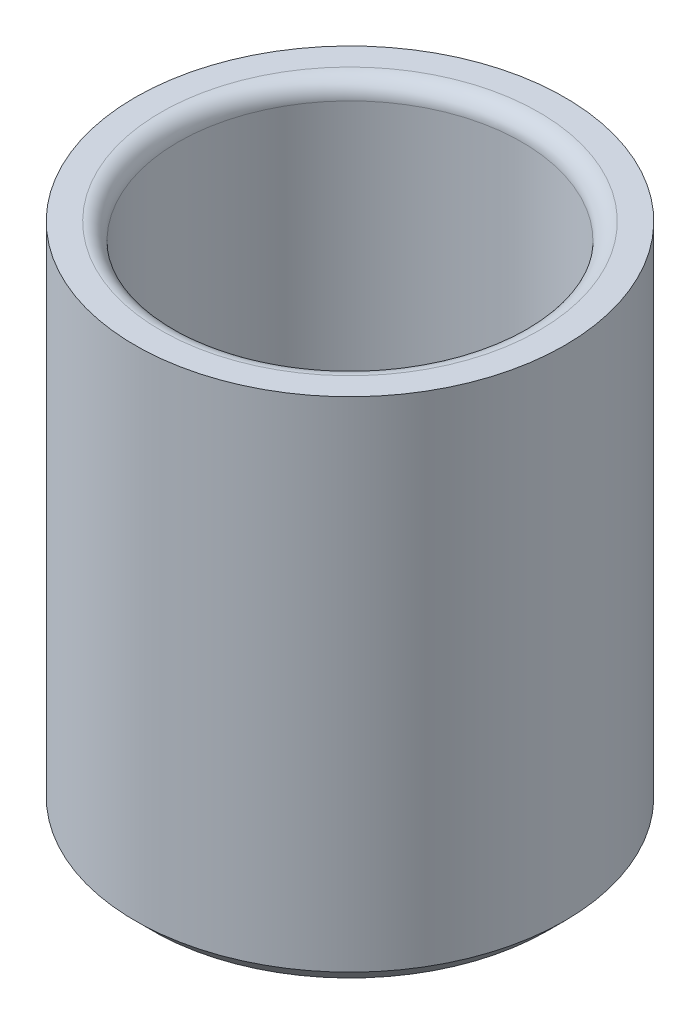
ISO-10303-21;
HEADER;
FILE_DESCRIPTION(('STEP AP214'),'2;1');
FILE_NAME('part.step','',(''),(''),'','','');
FILE_SCHEMA(('AUTOMOTIVE_DESIGN { 1 0 10303 214 1 1 1 1 }'));
ENDSEC;
DATA;
#1=APPLICATION_CONTEXT('core data for automotive mechanical design processes');
#2=APPLICATION_PROTOCOL_DEFINITION('international standard','automotive_design',2000,#1);
#3=PRODUCT_CONTEXT('',#1,'mechanical');
#4=PRODUCT('Part','Part','',(#3));
#5=PRODUCT_RELATED_PRODUCT_CATEGORY('part','',(#4));
#6=PRODUCT_DEFINITION_FORMATION('','',#4);
#7=PRODUCT_DEFINITION_CONTEXT('part definition',#1,'design');
#8=PRODUCT_DEFINITION('design','',#6,#7);
#9=PRODUCT_DEFINITION_SHAPE('','',#8);
#10=(LENGTH_UNIT() NAMED_UNIT(*) SI_UNIT(.MILLI.,.METRE.));
#11=(NAMED_UNIT(*) PLANE_ANGLE_UNIT() SI_UNIT($,.RADIAN.));
#12=(NAMED_UNIT(*) SI_UNIT($,.STERADIAN.) SOLID_ANGLE_UNIT());
#13=UNCERTAINTY_MEASURE_WITH_UNIT(LENGTH_MEASURE(1.E-05),#10,'distance_accuracy_value','');
#14=(GEOMETRIC_REPRESENTATION_CONTEXT(3) GLOBAL_UNCERTAINTY_ASSIGNED_CONTEXT((#13)) GLOBAL_UNIT_ASSIGNED_CONTEXT((#10,
#11,#12)) REPRESENTATION_CONTEXT('',''));
#15=CARTESIAN_POINT('',(0.,0.,0.));
#16=DIRECTION('',(0.,0.,1.));
#17=DIRECTION('',(1.,0.,0.));
#18=AXIS2_PLACEMENT_3D('',#15,#16,#17);
#19=CARTESIAN_POINT('',(0.,0.,0.));
#20=DIRECTION('',(0.,1.,0.));
#21=DIRECTION('',(-1.,0.,0.));
#22=AXIS2_PLACEMENT_3D('',#19,#20,#21);
#23=CYLINDRICAL_SURFACE('',#22,6.35);
#24=CARTESIAN_POINT('',(0.,-0.635000000000001,0.));
#25=DIRECTION('',(0.,-1.,0.));
#26=DIRECTION('',(1.,0.,0.));
#27=AXIS2_PLACEMENT_3D('',#24,#25,#26);
#28=CIRCLE('',#27,6.35);
#29=CARTESIAN_POINT('',(6.35,-0.635,0.));
#30=VERTEX_POINT('',#29);
#31=EDGE_CURVE('E51',#30,#30,#28,.F.);
#32=ORIENTED_EDGE('',*,*,#31,.T.);
#33=EDGE_LOOP('',(#32));
#34=FACE_BOUND('',#33,.T.);
#35=CARTESIAN_POINT('',(0.,-19.05,0.));
#36=DIRECTION('',(0.,1.,0.));
#37=DIRECTION('',(-1.,0.,0.));
#38=AXIS2_PLACEMENT_3D('',#35,#36,#37);
#39=CIRCLE('',#38,6.35);
#40=CARTESIAN_POINT('',(-6.35,-19.05,0.));
#41=VERTEX_POINT('',#40);
#42=EDGE_CURVE('E56',#41,#41,#39,.T.);
#43=ORIENTED_EDGE('',*,*,#42,.F.);
#44=EDGE_LOOP('',(#43));
#45=FACE_BOUND('',#44,.T.);
#46=ADVANCED_FACE('F36',(#34,#45),#23,.F.);
#47=CARTESIAN_POINT('',(6.35,-19.05,0.));
#48=DIRECTION('',(0.,1.,0.));
#49=DIRECTION('',(-1.,0.,0.));
#50=AXIS2_PLACEMENT_3D('',#47,#48,#49);
#51=PLANE('',#50);
#52=CARTESIAN_POINT('',(0.,-19.05,0.));
#53=DIRECTION('',(0.,1.,0.));
#54=DIRECTION('',(-1.,0.,0.));
#55=AXIS2_PLACEMENT_3D('',#52,#53,#54);
#56=CIRCLE('',#55,7.30249999999999);
#57=CARTESIAN_POINT('',(-7.30249999999999,-19.05,0.));
#58=VERTEX_POINT('',#57);
#59=EDGE_CURVE('E10',#58,#58,#56,.F.);
#60=ORIENTED_EDGE('',*,*,#59,.T.);
#61=EDGE_LOOP('',(#60));
#62=FACE_BOUND('',#61,.T.);
#63=ORIENTED_EDGE('',*,*,#42,.T.);
#64=EDGE_LOOP('',(#63));
#65=FACE_BOUND('',#64,.T.);
#66=ADVANCED_FACE('F67',(#62,#65),#51,.F.);
#67=CARTESIAN_POINT('',(0.,0.,0.));
#68=DIRECTION('',(0.,1.,0.));
#69=DIRECTION('',(-1.,0.,0.));
#70=AXIS2_PLACEMENT_3D('',#67,#68,#69);
#71=CYLINDRICAL_SURFACE('',#70,7.9375);
#72=CARTESIAN_POINT('',(0.,-18.415,0.));
#73=DIRECTION('',(0.,1.,0.));
#74=DIRECTION('',(-1.,0.,0.));
#75=AXIS2_PLACEMENT_3D('',#72,#73,#74);
#76=CIRCLE('',#75,7.9375);
#77=CARTESIAN_POINT('',(-7.9375,-18.415,0.));
#78=VERTEX_POINT('',#77);
#79=EDGE_CURVE('E43',#78,#78,#76,.T.);
#80=ORIENTED_EDGE('',*,*,#79,.T.);
#81=EDGE_LOOP('',(#80));
#82=FACE_BOUND('',#81,.T.);
#83=CARTESIAN_POINT('',(0.,0.,0.));
#84=DIRECTION('',(0.,1.,0.));
#85=DIRECTION('',(-1.,0.,0.));
#86=AXIS2_PLACEMENT_3D('',#83,#84,#85);
#87=CIRCLE('',#86,7.9375);
#88=CARTESIAN_POINT('',(-7.9375,0.,0.));
#89=VERTEX_POINT('',#88);
#90=EDGE_CURVE('E59',#89,#89,#87,.T.);
#91=ORIENTED_EDGE('',*,*,#90,.F.);
#92=EDGE_LOOP('',(#91));
#93=FACE_BOUND('',#92,.T.);
#94=ADVANCED_FACE('F65',(#82,#93),#71,.T.);
#95=CARTESIAN_POINT('',(6.35,0.,0.));
#96=DIRECTION('',(0.,-1.,0.));
#97=DIRECTION('',(1.,0.,0.));
#98=AXIS2_PLACEMENT_3D('',#95,#96,#97);
#99=PLANE('',#98);
#100=CARTESIAN_POINT('',(0.,0.,0.));
#101=DIRECTION('',(0.,-1.,0.));
#102=DIRECTION('',(1.,0.,0.));
#103=AXIS2_PLACEMENT_3D('',#100,#101,#102);
#104=CIRCLE('',#103,6.985);
#105=CARTESIAN_POINT('',(6.985,0.,0.));
#106=VERTEX_POINT('',#105);
#107=EDGE_CURVE('E47',#106,#106,#104,.T.);
#108=ORIENTED_EDGE('',*,*,#107,.T.);
#109=EDGE_LOOP('',(#108));
#110=FACE_BOUND('',#109,.T.);
#111=ORIENTED_EDGE('',*,*,#90,.T.);
#112=EDGE_LOOP('',(#111));
#113=FACE_BOUND('',#112,.T.);
#114=ADVANCED_FACE('F63',(#110,#113),#99,.F.);
#115=CARTESIAN_POINT('',(0.,-0.635000000000001,0.));
#116=DIRECTION('',(0.,-1.,0.));
#117=DIRECTION('',(1.,0.,0.));
#118=AXIS2_PLACEMENT_3D('',#115,#116,#117);
#119=TOROIDAL_SURFACE('',#118,6.985,0.635);
#120=ORIENTED_EDGE('',*,*,#107,.F.);
#121=EDGE_LOOP('',(#120));
#122=FACE_BOUND('',#121,.T.);
#123=ORIENTED_EDGE('',*,*,#31,.F.);
#124=EDGE_LOOP('',(#123));
#125=FACE_BOUND('',#124,.T.);
#126=ADVANCED_FACE('F73',(#122,#125),#119,.T.);
#127=CARTESIAN_POINT('',(0.,-18.415,0.));
#128=DIRECTION('',(0.,1.,0.));
#129=DIRECTION('',(-1.,0.,0.));
#130=AXIS2_PLACEMENT_3D('',#127,#128,#129);
#131=CONICAL_SURFACE('',#130,7.9375,0.785398163397451);
#132=ORIENTED_EDGE('',*,*,#59,.F.);
#133=EDGE_LOOP('',(#132));
#134=FACE_BOUND('',#133,.T.);
#135=ORIENTED_EDGE('',*,*,#79,.F.);
#136=EDGE_LOOP('',(#135));
#137=FACE_BOUND('',#136,.T.);
#138=ADVANCED_FACE('F38',(#134,#137),#131,.T.);
#139=CLOSED_SHELL('',(#46,#66,#94,#114,#126,#138));
#140=MANIFOLD_SOLID_BREP('B2',#139);
#141=ADVANCED_BREP_SHAPE_REPRESENTATION('',(#18,#140),#14);
#142=SHAPE_DEFINITION_REPRESENTATION(#9,#141);
ENDSEC;
END-ISO-10303-21;
